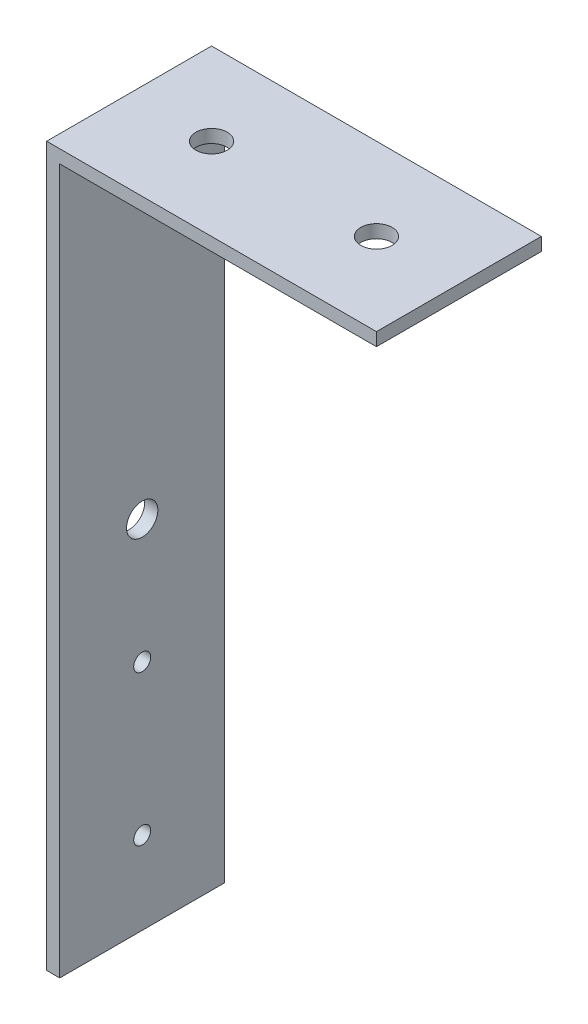
ISO-10303-21;
HEADER;
FILE_DESCRIPTION(('STEP AP214'),'2;1');
FILE_NAME('part.step','',(''),(''),'','','');
FILE_SCHEMA(('AUTOMOTIVE_DESIGN { 1 0 10303 214 1 1 1 1 }'));
ENDSEC;
DATA;
#1=APPLICATION_CONTEXT('core data for automotive mechanical design processes');
#2=APPLICATION_PROTOCOL_DEFINITION('international standard','automotive_design',2000,#1);
#3=PRODUCT_CONTEXT('',#1,'mechanical');
#4=PRODUCT('Part','Part','',(#3));
#5=PRODUCT_RELATED_PRODUCT_CATEGORY('part','',(#4));
#6=PRODUCT_DEFINITION_FORMATION('','',#4);
#7=PRODUCT_DEFINITION_CONTEXT('part definition',#1,'design');
#8=PRODUCT_DEFINITION('design','',#6,#7);
#9=PRODUCT_DEFINITION_SHAPE('','',#8);
#10=(LENGTH_UNIT() NAMED_UNIT(*) SI_UNIT(.MILLI.,.METRE.));
#11=(NAMED_UNIT(*) PLANE_ANGLE_UNIT() SI_UNIT($,.RADIAN.));
#12=(NAMED_UNIT(*) SI_UNIT($,.STERADIAN.) SOLID_ANGLE_UNIT());
#13=UNCERTAINTY_MEASURE_WITH_UNIT(LENGTH_MEASURE(1.E-05),#10,'distance_accuracy_value','');
#14=(GEOMETRIC_REPRESENTATION_CONTEXT(3) GLOBAL_UNCERTAINTY_ASSIGNED_CONTEXT((#13)) GLOBAL_UNIT_ASSIGNED_CONTEXT((#10,
#11,#12)) REPRESENTATION_CONTEXT('',''));
#15=CARTESIAN_POINT('',(0.,0.,0.));
#16=DIRECTION('',(0.,0.,1.));
#17=DIRECTION('',(1.,0.,0.));
#18=AXIS2_PLACEMENT_3D('',#15,#16,#17);
#19=CARTESIAN_POINT('',(0.,0.,20.));
#20=DIRECTION('',(0.,1.,0.));
#21=DIRECTION('',(0.,0.,1.));
#22=AXIS2_PLACEMENT_3D('',#19,#20,#21);
#23=PLANE('',#22);
#24=DIRECTION('',(1.,0.,0.));
#25=VECTOR('',#24,1.);
#26=CARTESIAN_POINT('',(0.,0.,0.));
#27=LINE('',#26,#25);
#28=CARTESIAN_POINT('',(0.,0.,0.));
#29=VERTEX_POINT('',#28);
#30=CARTESIAN_POINT('',(1.5875,0.,0.));
#31=VERTEX_POINT('',#30);
#32=EDGE_CURVE('E119',#29,#31,#27,.T.);
#33=ORIENTED_EDGE('',*,*,#32,.T.);
#34=DIRECTION('',(0.,0.,-1.));
#35=VECTOR('',#34,1.);
#36=CARTESIAN_POINT('',(1.5875,0.,20.));
#37=LINE('',#36,#35);
#38=CARTESIAN_POINT('',(1.5875,0.,20.));
#39=VERTEX_POINT('',#38);
#40=EDGE_CURVE('E11',#39,#31,#37,.T.);
#41=ORIENTED_EDGE('',*,*,#40,.F.);
#42=DIRECTION('',(1.,0.,0.));
#43=VECTOR('',#42,1.);
#44=CARTESIAN_POINT('',(0.,0.,20.));
#45=LINE('',#44,#43);
#46=CARTESIAN_POINT('',(0.,0.,20.));
#47=VERTEX_POINT('',#46);
#48=EDGE_CURVE('E129',#47,#39,#45,.T.);
#49=ORIENTED_EDGE('',*,*,#48,.F.);
#50=DIRECTION('',(0.,0.,-1.));
#51=VECTOR('',#50,1.);
#52=CARTESIAN_POINT('',(0.,0.,20.));
#53=LINE('',#52,#51);
#54=EDGE_CURVE('E115',#47,#29,#53,.T.);
#55=ORIENTED_EDGE('',*,*,#54,.T.);
#56=EDGE_LOOP('',(#33,#41,#49,#55));
#57=FACE_BOUND('',#56,.T.);
#58=ADVANCED_FACE('F34',(#57),#23,.F.);
#59=CARTESIAN_POINT('',(1.5875,0.,20.));
#60=DIRECTION('',(-1.,0.,0.));
#61=DIRECTION('',(0.,0.,1.));
#62=AXIS2_PLACEMENT_3D('',#59,#60,#61);
#63=PLANE('',#62);
#64=CARTESIAN_POINT('',(1.5875,43.2,10.));
#65=DIRECTION('',(-1.,0.,0.));
#66=DIRECTION('',(0.,0.,1.));
#67=AXIS2_PLACEMENT_3D('',#64,#65,#66);
#68=CIRCLE('',#67,1.89864999999999);
#69=CARTESIAN_POINT('',(1.5875,43.2,11.89865));
#70=VERTEX_POINT('',#69);
#71=EDGE_CURVE('E253',#70,#70,#68,.T.);
#72=ORIENTED_EDGE('',*,*,#71,.T.);
#73=EDGE_LOOP('',(#72));
#74=FACE_BOUND('',#73,.T.);
#75=CARTESIAN_POINT('',(1.5875,10.,10.));
#76=DIRECTION('',(-1.,0.,0.));
#77=DIRECTION('',(0.,0.,1.));
#78=AXIS2_PLACEMENT_3D('',#75,#76,#77);
#79=CIRCLE('',#78,1.0287);
#80=CARTESIAN_POINT('',(1.5875,10.,11.0287));
#81=VERTEX_POINT('',#80);
#82=EDGE_CURVE('E257',#81,#81,#79,.T.);
#83=ORIENTED_EDGE('',*,*,#82,.T.);
#84=EDGE_LOOP('',(#83));
#85=FACE_BOUND('',#84,.T.);
#86=CARTESIAN_POINT('',(1.5875,28.2,10.));
#87=DIRECTION('',(-1.,0.,0.));
#88=DIRECTION('',(0.,0.,1.));
#89=AXIS2_PLACEMENT_3D('',#86,#87,#88);
#90=CIRCLE('',#89,1.0287);
#91=CARTESIAN_POINT('',(1.5875,28.2,11.0287));
#92=VERTEX_POINT('',#91);
#93=EDGE_CURVE('E266',#92,#92,#90,.T.);
#94=ORIENTED_EDGE('',*,*,#93,.T.);
#95=EDGE_LOOP('',(#94));
#96=FACE_BOUND('',#95,.T.);
#97=DIRECTION('',(0.,1.,0.));
#98=VECTOR('',#97,1.);
#99=CARTESIAN_POINT('',(1.5875,0.,0.));
#100=LINE('',#99,#98);
#101=CARTESIAN_POINT('',(1.5875,85.5125,0.));
#102=VERTEX_POINT('',#101);
#103=EDGE_CURVE('E122',#31,#102,#100,.T.);
#104=ORIENTED_EDGE('',*,*,#103,.T.);
#105=DIRECTION('',(0.,0.,-1.));
#106=VECTOR('',#105,1.);
#107=CARTESIAN_POINT('',(1.5875,85.5125,20.));
#108=LINE('',#107,#106);
#109=CARTESIAN_POINT('',(1.5875,85.5125,20.));
#110=VERTEX_POINT('',#109);
#111=EDGE_CURVE('E43',#110,#102,#108,.T.);
#112=ORIENTED_EDGE('',*,*,#111,.F.);
#113=DIRECTION('',(0.,1.,0.));
#114=VECTOR('',#113,1.);
#115=CARTESIAN_POINT('',(1.5875,0.,20.));
#116=LINE('',#115,#114);
#117=EDGE_CURVE('E88',#39,#110,#116,.T.);
#118=ORIENTED_EDGE('',*,*,#117,.F.);
#119=ORIENTED_EDGE('',*,*,#40,.T.);
#120=EDGE_LOOP('',(#104,#112,#118,#119));
#121=FACE_BOUND('',#120,.T.);
#122=ADVANCED_FACE('F160',(#74,#85,#96,#121),#63,.F.);
#123=CARTESIAN_POINT('',(1.5875,85.5125,20.));
#124=DIRECTION('',(0.,1.,0.));
#125=DIRECTION('',(0.,0.,1.));
#126=AXIS2_PLACEMENT_3D('',#123,#124,#125);
#127=PLANE('',#126);
#128=CARTESIAN_POINT('',(10.,85.5125,10.));
#129=DIRECTION('',(0.,1.,0.));
#130=DIRECTION('',(0.,0.,1.));
#131=AXIS2_PLACEMENT_3D('',#128,#129,#130);
#132=CIRCLE('',#131,1.89864999999999);
#133=CARTESIAN_POINT('',(10.,85.5125,11.89865));
#134=VERTEX_POINT('',#133);
#135=EDGE_CURVE('E272',#134,#134,#132,.T.);
#136=ORIENTED_EDGE('',*,*,#135,.T.);
#137=EDGE_LOOP('',(#136));
#138=FACE_BOUND('',#137,.T.);
#139=CARTESIAN_POINT('',(30.,85.5125,10.));
#140=DIRECTION('',(0.,1.,0.));
#141=DIRECTION('',(0.,0.,1.));
#142=AXIS2_PLACEMENT_3D('',#139,#140,#141);
#143=CIRCLE('',#142,1.89864999999999);
#144=CARTESIAN_POINT('',(30.,85.5125,11.89865));
#145=VERTEX_POINT('',#144);
#146=EDGE_CURVE('E37',#145,#145,#143,.T.);
#147=ORIENTED_EDGE('',*,*,#146,.T.);
#148=EDGE_LOOP('',(#147));
#149=FACE_BOUND('',#148,.T.);
#150=DIRECTION('',(1.,0.,0.));
#151=VECTOR('',#150,1.);
#152=CARTESIAN_POINT('',(1.5875,85.5125,0.));
#153=LINE('',#152,#151);
#154=CARTESIAN_POINT('',(40.,85.5125,0.));
#155=VERTEX_POINT('',#154);
#156=EDGE_CURVE('E124',#102,#155,#153,.T.);
#157=ORIENTED_EDGE('',*,*,#156,.T.);
#158=DIRECTION('',(0.,0.,-1.));
#159=VECTOR('',#158,1.);
#160=CARTESIAN_POINT('',(40.,85.5125,20.));
#161=LINE('',#160,#159);
#162=CARTESIAN_POINT('',(40.,85.5125,20.));
#163=VERTEX_POINT('',#162);
#164=EDGE_CURVE('E110',#163,#155,#161,.T.);
#165=ORIENTED_EDGE('',*,*,#164,.F.);
#166=DIRECTION('',(1.,0.,0.));
#167=VECTOR('',#166,1.);
#168=CARTESIAN_POINT('',(1.5875,85.5125,20.));
#169=LINE('',#168,#167);
#170=EDGE_CURVE('E101',#110,#163,#169,.T.);
#171=ORIENTED_EDGE('',*,*,#170,.F.);
#172=ORIENTED_EDGE('',*,*,#111,.T.);
#173=EDGE_LOOP('',(#157,#165,#171,#172));
#174=FACE_BOUND('',#173,.T.);
#175=ADVANCED_FACE('F136',(#138,#149,#174),#127,.F.);
#176=CARTESIAN_POINT('',(40.,87.1,20.));
#177=DIRECTION('',(-1.,0.,0.));
#178=DIRECTION('',(0.,0.,1.));
#179=AXIS2_PLACEMENT_3D('',#176,#177,#178);
#180=PLANE('',#179);
#181=DIRECTION('',(0.,1.,0.));
#182=VECTOR('',#181,1.);
#183=CARTESIAN_POINT('',(40.,87.1,0.));
#184=LINE('',#183,#182);
#185=CARTESIAN_POINT('',(40.,87.1,0.));
#186=VERTEX_POINT('',#185);
#187=EDGE_CURVE('E109',#155,#186,#184,.T.);
#188=ORIENTED_EDGE('',*,*,#187,.T.);
#189=DIRECTION('',(0.,0.,-1.));
#190=VECTOR('',#189,1.);
#191=CARTESIAN_POINT('',(40.,87.1,20.));
#192=LINE('',#191,#190);
#193=CARTESIAN_POINT('',(40.,87.1,20.));
#194=VERTEX_POINT('',#193);
#195=EDGE_CURVE('E106',#194,#186,#192,.T.);
#196=ORIENTED_EDGE('',*,*,#195,.F.);
#197=DIRECTION('',(0.,1.,0.));
#198=VECTOR('',#197,1.);
#199=CARTESIAN_POINT('',(40.,87.1,20.));
#200=LINE('',#199,#198);
#201=EDGE_CURVE('E95',#163,#194,#200,.T.);
#202=ORIENTED_EDGE('',*,*,#201,.F.);
#203=ORIENTED_EDGE('',*,*,#164,.T.);
#204=EDGE_LOOP('',(#188,#196,#202,#203));
#205=FACE_BOUND('',#204,.T.);
#206=ADVANCED_FACE('F107',(#205),#180,.F.);
#207=CARTESIAN_POINT('',(0.,87.1,20.));
#208=DIRECTION('',(0.,-1.,0.));
#209=DIRECTION('',(0.,0.,-1.));
#210=AXIS2_PLACEMENT_3D('',#207,#208,#209);
#211=PLANE('',#210);
#212=CARTESIAN_POINT('',(10.,87.1,10.));
#213=DIRECTION('',(0.,1.,0.));
#214=DIRECTION('',(0.,0.,1.));
#215=AXIS2_PLACEMENT_3D('',#212,#213,#214);
#216=CIRCLE('',#215,1.89865);
#217=CARTESIAN_POINT('',(10.,87.1,11.89865));
#218=VERTEX_POINT('',#217);
#219=EDGE_CURVE('E269',#218,#218,#216,.T.);
#220=ORIENTED_EDGE('',*,*,#219,.F.);
#221=EDGE_LOOP('',(#220));
#222=FACE_BOUND('',#221,.T.);
#223=CARTESIAN_POINT('',(30.,87.1,10.));
#224=DIRECTION('',(0.,1.,0.));
#225=DIRECTION('',(0.,0.,1.));
#226=AXIS2_PLACEMENT_3D('',#223,#224,#225);
#227=CIRCLE('',#226,1.89865);
#228=CARTESIAN_POINT('',(30.,87.1,11.89865));
#229=VERTEX_POINT('',#228);
#230=EDGE_CURVE('E275',#229,#229,#227,.T.);
#231=ORIENTED_EDGE('',*,*,#230,.F.);
#232=EDGE_LOOP('',(#231));
#233=FACE_BOUND('',#232,.T.);
#234=DIRECTION('',(-1.,0.,0.));
#235=VECTOR('',#234,1.);
#236=CARTESIAN_POINT('',(0.,87.1,0.));
#237=LINE('',#236,#235);
#238=CARTESIAN_POINT('',(0.,87.1,0.));
#239=VERTEX_POINT('',#238);
#240=EDGE_CURVE('E74',#186,#239,#237,.T.);
#241=ORIENTED_EDGE('',*,*,#240,.T.);
#242=DIRECTION('',(0.,0.,-1.));
#243=VECTOR('',#242,1.);
#244=CARTESIAN_POINT('',(0.,87.1,20.));
#245=LINE('',#244,#243);
#246=CARTESIAN_POINT('',(0.,87.1,20.));
#247=VERTEX_POINT('',#246);
#248=EDGE_CURVE('E111',#247,#239,#245,.T.);
#249=ORIENTED_EDGE('',*,*,#248,.F.);
#250=DIRECTION('',(-1.,0.,0.));
#251=VECTOR('',#250,1.);
#252=CARTESIAN_POINT('',(0.,87.1,20.));
#253=LINE('',#252,#251);
#254=EDGE_CURVE('E99',#194,#247,#253,.T.);
#255=ORIENTED_EDGE('',*,*,#254,.F.);
#256=ORIENTED_EDGE('',*,*,#195,.T.);
#257=EDGE_LOOP('',(#241,#249,#255,#256));
#258=FACE_BOUND('',#257,.T.);
#259=ADVANCED_FACE('F113',(#222,#233,#258),#211,.F.);
#260=CARTESIAN_POINT('',(0.,0.,20.));
#261=DIRECTION('',(1.,0.,0.));
#262=DIRECTION('',(0.,0.,-1.));
#263=AXIS2_PLACEMENT_3D('',#260,#261,#262);
#264=PLANE('',#263);
#265=CARTESIAN_POINT('',(0.,43.2,10.));
#266=DIRECTION('',(-1.,0.,0.));
#267=DIRECTION('',(0.,0.,1.));
#268=AXIS2_PLACEMENT_3D('',#265,#266,#267);
#269=CIRCLE('',#268,1.89864999999999);
#270=CARTESIAN_POINT('',(0.,43.2,11.89865));
#271=VERTEX_POINT('',#270);
#272=EDGE_CURVE('E251',#271,#271,#269,.T.);
#273=ORIENTED_EDGE('',*,*,#272,.F.);
#274=EDGE_LOOP('',(#273));
#275=FACE_BOUND('',#274,.T.);
#276=CARTESIAN_POINT('',(0.,10.,10.));
#277=DIRECTION('',(-1.,0.,0.));
#278=DIRECTION('',(0.,0.,1.));
#279=AXIS2_PLACEMENT_3D('',#276,#277,#278);
#280=CIRCLE('',#279,1.0287);
#281=CARTESIAN_POINT('',(0.,10.,11.0287));
#282=VERTEX_POINT('',#281);
#283=EDGE_CURVE('E254',#282,#282,#280,.T.);
#284=ORIENTED_EDGE('',*,*,#283,.F.);
#285=EDGE_LOOP('',(#284));
#286=FACE_BOUND('',#285,.T.);
#287=CARTESIAN_POINT('',(0.,28.2,10.));
#288=DIRECTION('',(-1.,0.,0.));
#289=DIRECTION('',(0.,0.,1.));
#290=AXIS2_PLACEMENT_3D('',#287,#288,#289);
#291=CIRCLE('',#290,1.0287);
#292=CARTESIAN_POINT('',(0.,28.2,11.0287));
#293=VERTEX_POINT('',#292);
#294=EDGE_CURVE('E263',#293,#293,#291,.T.);
#295=ORIENTED_EDGE('',*,*,#294,.F.);
#296=EDGE_LOOP('',(#295));
#297=FACE_BOUND('',#296,.T.);
#298=DIRECTION('',(0.,-1.,0.));
#299=VECTOR('',#298,1.);
#300=CARTESIAN_POINT('',(0.,0.,0.));
#301=LINE('',#300,#299);
#302=EDGE_CURVE('E80',#239,#29,#301,.T.);
#303=ORIENTED_EDGE('',*,*,#302,.T.);
#304=ORIENTED_EDGE('',*,*,#54,.F.);
#305=DIRECTION('',(0.,-1.,0.));
#306=VECTOR('',#305,1.);
#307=CARTESIAN_POINT('',(0.,0.,20.));
#308=LINE('',#307,#306);
#309=EDGE_CURVE('E51',#247,#47,#308,.T.);
#310=ORIENTED_EDGE('',*,*,#309,.F.);
#311=ORIENTED_EDGE('',*,*,#248,.T.);
#312=EDGE_LOOP('',(#303,#304,#310,#311));
#313=FACE_BOUND('',#312,.T.);
#314=ADVANCED_FACE('F143',(#275,#286,#297,#313),#264,.F.);
#315=CARTESIAN_POINT('',(0.,0.,20.));
#316=DIRECTION('',(0.,0.,1.));
#317=DIRECTION('',(1.,0.,0.));
#318=AXIS2_PLACEMENT_3D('',#315,#316,#317);
#319=PLANE('',#318);
#320=ORIENTED_EDGE('',*,*,#48,.T.);
#321=ORIENTED_EDGE('',*,*,#117,.T.);
#322=ORIENTED_EDGE('',*,*,#170,.T.);
#323=ORIENTED_EDGE('',*,*,#201,.T.);
#324=ORIENTED_EDGE('',*,*,#254,.T.);
#325=ORIENTED_EDGE('',*,*,#309,.T.);
#326=EDGE_LOOP('',(#320,#321,#322,#323,#324,#325));
#327=FACE_BOUND('',#326,.T.);
#328=ADVANCED_FACE('F97',(#327),#319,.T.);
#329=CARTESIAN_POINT('',(0.,0.,0.));
#330=DIRECTION('',(0.,0.,1.));
#331=DIRECTION('',(1.,0.,0.));
#332=AXIS2_PLACEMENT_3D('',#329,#330,#331);
#333=PLANE('',#332);
#334=ORIENTED_EDGE('',*,*,#32,.F.);
#335=ORIENTED_EDGE('',*,*,#302,.F.);
#336=ORIENTED_EDGE('',*,*,#240,.F.);
#337=ORIENTED_EDGE('',*,*,#187,.F.);
#338=ORIENTED_EDGE('',*,*,#156,.F.);
#339=ORIENTED_EDGE('',*,*,#103,.F.);
#340=EDGE_LOOP('',(#334,#335,#336,#337,#338,#339));
#341=FACE_BOUND('',#340,.T.);
#342=ADVANCED_FACE('F139',(#341),#333,.F.);
#343=CARTESIAN_POINT('',(30.,87.1,10.));
#344=DIRECTION('',(0.,1.,0.));
#345=DIRECTION('',(0.,0.,1.));
#346=AXIS2_PLACEMENT_3D('',#343,#344,#345);
#347=CYLINDRICAL_SURFACE('',#346,1.89864999999999);
#348=ORIENTED_EDGE('',*,*,#230,.T.);
#349=EDGE_LOOP('',(#348));
#350=FACE_BOUND('',#349,.T.);
#351=ORIENTED_EDGE('',*,*,#146,.F.);
#352=EDGE_LOOP('',(#351));
#353=FACE_BOUND('',#352,.T.);
#354=ADVANCED_FACE('F197',(#350,#353),#347,.F.);
#355=CARTESIAN_POINT('',(10.,87.1,10.));
#356=DIRECTION('',(0.,1.,0.));
#357=DIRECTION('',(0.,0.,1.));
#358=AXIS2_PLACEMENT_3D('',#355,#356,#357);
#359=CYLINDRICAL_SURFACE('',#358,1.89864999999999);
#360=ORIENTED_EDGE('',*,*,#219,.T.);
#361=EDGE_LOOP('',(#360));
#362=FACE_BOUND('',#361,.T.);
#363=ORIENTED_EDGE('',*,*,#135,.F.);
#364=EDGE_LOOP('',(#363));
#365=FACE_BOUND('',#364,.T.);
#366=ADVANCED_FACE('F202',(#362,#365),#359,.F.);
#367=CARTESIAN_POINT('',(0.,28.2,10.));
#368=DIRECTION('',(-1.,0.,0.));
#369=DIRECTION('',(0.,0.,1.));
#370=AXIS2_PLACEMENT_3D('',#367,#368,#369);
#371=CYLINDRICAL_SURFACE('',#370,1.0287);
#372=ORIENTED_EDGE('',*,*,#294,.T.);
#373=EDGE_LOOP('',(#372));
#374=FACE_BOUND('',#373,.T.);
#375=ORIENTED_EDGE('',*,*,#93,.F.);
#376=EDGE_LOOP('',(#375));
#377=FACE_BOUND('',#376,.T.);
#378=ADVANCED_FACE('F210',(#374,#377),#371,.F.);
#379=CARTESIAN_POINT('',(0.,10.,10.));
#380=DIRECTION('',(-1.,0.,0.));
#381=DIRECTION('',(0.,0.,1.));
#382=AXIS2_PLACEMENT_3D('',#379,#380,#381);
#383=CYLINDRICAL_SURFACE('',#382,1.0287);
#384=ORIENTED_EDGE('',*,*,#283,.T.);
#385=EDGE_LOOP('',(#384));
#386=FACE_BOUND('',#385,.T.);
#387=ORIENTED_EDGE('',*,*,#82,.F.);
#388=EDGE_LOOP('',(#387));
#389=FACE_BOUND('',#388,.T.);
#390=ADVANCED_FACE('F218',(#386,#389),#383,.F.);
#391=CARTESIAN_POINT('',(0.,43.2,10.));
#392=DIRECTION('',(-1.,0.,0.));
#393=DIRECTION('',(0.,0.,1.));
#394=AXIS2_PLACEMENT_3D('',#391,#392,#393);
#395=CYLINDRICAL_SURFACE('',#394,1.89864999999999);
#396=ORIENTED_EDGE('',*,*,#272,.T.);
#397=EDGE_LOOP('',(#396));
#398=FACE_BOUND('',#397,.T.);
#399=ORIENTED_EDGE('',*,*,#71,.F.);
#400=EDGE_LOOP('',(#399));
#401=FACE_BOUND('',#400,.T.);
#402=ADVANCED_FACE('F225',(#398,#401),#395,.F.);
#403=CLOSED_SHELL('',(#58,#122,#175,#206,#259,#314,#328,#342,#354,#366,#378,#390,#402));
#404=MANIFOLD_SOLID_BREP('B2',#403);
#405=ADVANCED_BREP_SHAPE_REPRESENTATION('',(#18,#404),#14);
#406=SHAPE_DEFINITION_REPRESENTATION(#9,#405);
ENDSEC;
END-ISO-10303-21;
